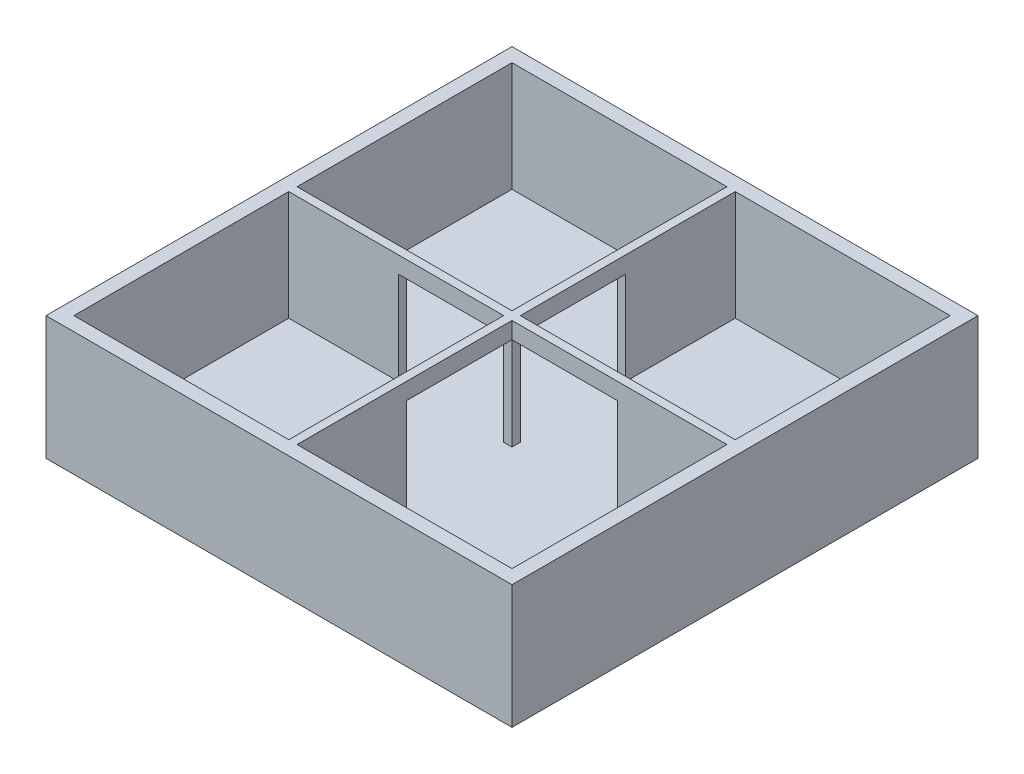
ISO-10303-21;
HEADER;
FILE_DESCRIPTION(('STEP AP214'),'2;1');
FILE_NAME('part.step','',(''),(''),'','','');
FILE_SCHEMA(('AUTOMOTIVE_DESIGN { 1 0 10303 214 1 1 1 1 }'));
ENDSEC;
DATA;
#1=APPLICATION_CONTEXT('core data for automotive mechanical design processes');
#2=APPLICATION_PROTOCOL_DEFINITION('international standard','automotive_design',2000,#1);
#3=PRODUCT_CONTEXT('',#1,'mechanical');
#4=PRODUCT('Part','Part','',(#3));
#5=PRODUCT_RELATED_PRODUCT_CATEGORY('part','',(#4));
#6=PRODUCT_DEFINITION_FORMATION('','',#4);
#7=PRODUCT_DEFINITION_CONTEXT('part definition',#1,'design');
#8=PRODUCT_DEFINITION('design','',#6,#7);
#9=PRODUCT_DEFINITION_SHAPE('','',#8);
#10=(LENGTH_UNIT() NAMED_UNIT(*) SI_UNIT(.MILLI.,.METRE.));
#11=(NAMED_UNIT(*) PLANE_ANGLE_UNIT() SI_UNIT($,.RADIAN.));
#12=(NAMED_UNIT(*) SI_UNIT($,.STERADIAN.) SOLID_ANGLE_UNIT());
#13=UNCERTAINTY_MEASURE_WITH_UNIT(LENGTH_MEASURE(1.E-05),#10,'distance_accuracy_value','');
#14=(GEOMETRIC_REPRESENTATION_CONTEXT(3) GLOBAL_UNCERTAINTY_ASSIGNED_CONTEXT((#13)) GLOBAL_UNIT_ASSIGNED_CONTEXT((#10,
#11,#12)) REPRESENTATION_CONTEXT('',''));
#15=CARTESIAN_POINT('',(0.,0.,0.));
#16=DIRECTION('',(0.,0.,1.));
#17=DIRECTION('',(1.,0.,0.));
#18=AXIS2_PLACEMENT_3D('',#15,#16,#17);
#19=CARTESIAN_POINT('',(0.,-2.54,0.));
#20=DIRECTION('',(0.,1.,0.));
#21=DIRECTION('',(0.,0.,1.));
#22=AXIS2_PLACEMENT_3D('',#19,#20,#21);
#23=PLANE('',#22);
#24=DIRECTION('',(0.,0.,1.));
#25=VECTOR('',#24,1.);
#26=CARTESIAN_POINT('',(76.2000000000027,-2.54,0.));
#27=LINE('',#26,#25);
#28=CARTESIAN_POINT('',(76.2000000000027,-2.54,-76.1999999999982));
#29=VERTEX_POINT('',#28);
#30=CARTESIAN_POINT('',(76.2000000000027,-2.54,76.2000000000018));
#31=VERTEX_POINT('',#30);
#32=EDGE_CURVE('E357',#29,#31,#27,.T.);
#33=ORIENTED_EDGE('',*,*,#32,.T.);
#34=DIRECTION('',(1.,0.,0.));
#35=VECTOR('',#34,1.);
#36=CARTESIAN_POINT('',(0.,-2.54,76.2000000000018));
#37=LINE('',#36,#35);
#38=CARTESIAN_POINT('',(-76.1999999999973,-2.54,76.2000000000018));
#39=VERTEX_POINT('',#38);
#40=EDGE_CURVE('E353',#39,#31,#37,.T.);
#41=ORIENTED_EDGE('',*,*,#40,.F.);
#42=DIRECTION('',(0.,0.,1.));
#43=VECTOR('',#42,1.);
#44=CARTESIAN_POINT('',(-76.1999999999973,-2.54,0.));
#45=LINE('',#44,#43);
#46=CARTESIAN_POINT('',(-76.1999999999973,-2.54,-76.1999999999982));
#47=VERTEX_POINT('',#46);
#48=EDGE_CURVE('E359',#47,#39,#45,.T.);
#49=ORIENTED_EDGE('',*,*,#48,.F.);
#50=DIRECTION('',(1.,0.,0.));
#51=VECTOR('',#50,1.);
#52=CARTESIAN_POINT('',(0.,-2.54,-76.1999999999982));
#53=LINE('',#52,#51);
#54=EDGE_CURVE('E363',#47,#29,#53,.T.);
#55=ORIENTED_EDGE('',*,*,#54,.T.);
#56=EDGE_LOOP('',(#33,#41,#49,#55));
#57=FACE_BOUND('',#56,.T.);
#58=DIRECTION('',(1.,0.,0.));
#59=VECTOR('',#58,1.);
#60=CARTESIAN_POINT('',(3999.99708000001,-2.54,3999.99708));
#61=LINE('',#60,#59);
#62=CARTESIAN_POINT('',(-3999.99708,-2.54,3999.99708));
#63=VERTEX_POINT('',#62);
#64=CARTESIAN_POINT('',(-76.2000000000373,-2.54,3999.99708));
#65=VERTEX_POINT('',#64);
#66=EDGE_CURVE('E264',#63,#65,#61,.T.);
#67=ORIENTED_EDGE('',*,*,#66,.T.);
#68=DIRECTION('',(0.,0.,1.));
#69=VECTOR('',#68,1.);
#70=CARTESIAN_POINT('',(-76.2000000000366,-2.54,3999.99708));
#71=LINE('',#70,#69);
#72=CARTESIAN_POINT('',(-76.1999999999893,-2.54,2000.00108));
#73=VERTEX_POINT('',#72);
#74=EDGE_CURVE('E68',#73,#65,#71,.T.);
#75=ORIENTED_EDGE('',*,*,#74,.F.);
#76=DIRECTION('',(-1.,0.,0.));
#77=VECTOR('',#76,1.);
#78=CARTESIAN_POINT('',(-76.1999999999893,-2.54,2000.00108));
#79=LINE('',#78,#77);
#80=CARTESIAN_POINT('',(76.200000000009,-2.54,2000.00108));
#81=VERTEX_POINT('',#80);
#82=EDGE_CURVE('E63',#81,#73,#79,.T.);
#83=ORIENTED_EDGE('',*,*,#82,.F.);
#84=DIRECTION('',(0.,0.,-1.));
#85=VECTOR('',#84,1.);
#86=CARTESIAN_POINT('',(76.200000000009,-2.54,2000.00108));
#87=LINE('',#86,#85);
#88=CARTESIAN_POINT('',(76.1999999999617,-2.54,3999.99708));
#89=VERTEX_POINT('',#88);
#90=EDGE_CURVE('E248',#89,#81,#87,.T.);
#91=ORIENTED_EDGE('',*,*,#90,.F.);
#92=CARTESIAN_POINT('',(3999.99708000001,-2.54,3999.99708));
#93=VERTEX_POINT('',#92);
#94=EDGE_CURVE('E257',#89,#93,#61,.T.);
#95=ORIENTED_EDGE('',*,*,#94,.T.);
#96=DIRECTION('',(0.,0.,-1.));
#97=VECTOR('',#96,1.);
#98=CARTESIAN_POINT('',(3999.99708000001,-2.54,3999.99708));
#99=LINE('',#98,#97);
#100=CARTESIAN_POINT('',(3999.99708,-2.54,76.2000000000227));
#101=VERTEX_POINT('',#100);
#102=EDGE_CURVE('E451',#93,#101,#99,.T.);
#103=ORIENTED_EDGE('',*,*,#102,.T.);
#104=DIRECTION('',(1.,0.,0.));
#105=VECTOR('',#104,1.);
#106=CARTESIAN_POINT('',(3999.99708,-2.54,76.2000000000227));
#107=LINE('',#106,#105);
#108=CARTESIAN_POINT('',(2000.00108000001,-2.54,76.1999999999942));
#109=VERTEX_POINT('',#108);
#110=EDGE_CURVE('E294',#109,#101,#107,.T.);
#111=ORIENTED_EDGE('',*,*,#110,.F.);
#112=DIRECTION('',(0.,0.,1.));
#113=VECTOR('',#112,1.);
#114=CARTESIAN_POINT('',(2000.00108000001,-2.54,76.1999999999942));
#115=LINE('',#114,#113);
#116=CARTESIAN_POINT('',(2000.00108000001,-2.54,-76.2000000000041));
#117=VERTEX_POINT('',#116);
#118=EDGE_CURVE('E284',#117,#109,#115,.T.);
#119=ORIENTED_EDGE('',*,*,#118,.F.);
#120=DIRECTION('',(-1.,0.,0.));
#121=VECTOR('',#120,1.);
#122=CARTESIAN_POINT('',(2000.00108000001,-2.54,-76.2000000000041));
#123=LINE('',#122,#121);
#124=CARTESIAN_POINT('',(3999.99708,-2.54,-76.1999999999757));
#125=VERTEX_POINT('',#124);
#126=EDGE_CURVE('E290',#125,#117,#123,.T.);
#127=ORIENTED_EDGE('',*,*,#126,.F.);
#128=CARTESIAN_POINT('',(3999.99708,-2.54,-3999.99708));
#129=VERTEX_POINT('',#128);
#130=EDGE_CURVE('E450',#125,#129,#99,.T.);
#131=ORIENTED_EDGE('',*,*,#130,.T.);
#132=DIRECTION('',(-1.,0.,0.));
#133=VECTOR('',#132,1.);
#134=CARTESIAN_POINT('',(3999.99708,-2.54,-3999.99708));
#135=LINE('',#134,#133);
#136=CARTESIAN_POINT('',(76.200000000008,-2.54,-3999.99708));
#137=VERTEX_POINT('',#136);
#138=EDGE_CURVE('E455',#129,#137,#135,.T.);
#139=ORIENTED_EDGE('',*,*,#138,.T.);
#140=DIRECTION('',(0.,0.,-1.));
#141=VECTOR('',#140,1.);
#142=CARTESIAN_POINT('',(76.2000000000082,-2.54,-3999.99708));
#143=LINE('',#142,#141);
#144=CARTESIAN_POINT('',(76.1999999999994,-2.54,-2000.00108));
#145=VERTEX_POINT('',#144);
#146=EDGE_CURVE('E318',#145,#137,#143,.T.);
#147=ORIENTED_EDGE('',*,*,#146,.F.);
#148=DIRECTION('',(1.,0.,0.));
#149=VECTOR('',#148,1.);
#150=CARTESIAN_POINT('',(76.1999999999994,-2.54,-2000.00108));
#151=LINE('',#150,#149);
#152=CARTESIAN_POINT('',(-76.199999999999,-2.54,-2000.00108));
#153=VERTEX_POINT('',#152);
#154=EDGE_CURVE('E308',#153,#145,#151,.T.);
#155=ORIENTED_EDGE('',*,*,#154,.F.);
#156=DIRECTION('',(0.,0.,1.));
#157=VECTOR('',#156,1.);
#158=CARTESIAN_POINT('',(-76.199999999999,-2.54,-2000.00108));
#159=LINE('',#158,#157);
#160=CARTESIAN_POINT('',(-76.1999999999901,-2.54,-3999.99708));
#161=VERTEX_POINT('',#160);
#162=EDGE_CURVE('E314',#161,#153,#159,.T.);
#163=ORIENTED_EDGE('',*,*,#162,.F.);
#164=CARTESIAN_POINT('',(-3999.99708,-2.54,-3999.99708));
#165=VERTEX_POINT('',#164);
#166=EDGE_CURVE('E454',#161,#165,#135,.T.);
#167=ORIENTED_EDGE('',*,*,#166,.T.);
#168=DIRECTION('',(0.,0.,1.));
#169=VECTOR('',#168,1.);
#170=CARTESIAN_POINT('',(-3999.99708,-2.54,3999.99708));
#171=LINE('',#170,#169);
#172=CARTESIAN_POINT('',(-3999.99708,-2.54,-76.1999999999947));
#173=VERTEX_POINT('',#172);
#174=EDGE_CURVE('E265',#165,#173,#171,.T.);
#175=ORIENTED_EDGE('',*,*,#174,.T.);
#176=DIRECTION('',(-1.,0.,0.));
#177=VECTOR('',#176,1.);
#178=CARTESIAN_POINT('',(-3999.99708,-2.54,-76.1999999999947));
#179=LINE('',#178,#177);
#180=CARTESIAN_POINT('',(-2000.00108,-2.54,-76.1999999999947));
#181=VERTEX_POINT('',#180);
#182=EDGE_CURVE('E332',#181,#173,#179,.T.);
#183=ORIENTED_EDGE('',*,*,#182,.F.);
#184=DIRECTION('',(0.,0.,-1.));
#185=VECTOR('',#184,1.);
#186=CARTESIAN_POINT('',(-2000.00108,-2.54,-76.1999999999947));
#187=LINE('',#186,#185);
#188=CARTESIAN_POINT('',(-2000.00108,-2.54,76.2000000000036));
#189=VERTEX_POINT('',#188);
#190=EDGE_CURVE('E338',#189,#181,#187,.T.);
#191=ORIENTED_EDGE('',*,*,#190,.F.);
#192=DIRECTION('',(1.,0.,0.));
#193=VECTOR('',#192,1.);
#194=CARTESIAN_POINT('',(-2000.00108,-2.54,76.2000000000036));
#195=LINE('',#194,#193);
#196=CARTESIAN_POINT('',(-3999.99708,-2.54,76.2000000000036));
#197=VERTEX_POINT('',#196);
#198=EDGE_CURVE('E331',#197,#189,#195,.T.);
#199=ORIENTED_EDGE('',*,*,#198,.F.);
#200=EDGE_CURVE('E445',#197,#63,#171,.T.);
#201=ORIENTED_EDGE('',*,*,#200,.T.);
#202=EDGE_LOOP('',(#67,#75,#83,#91,#95,#103,#111,#119,#127,#131,#139,#147,#155,#163,#167,#175,
#183,#191,#199,#201));
#203=FACE_BOUND('',#202,.T.);
#204=ADVANCED_FACE('F45',(#57,#203),#23,.T.);
#205=CARTESIAN_POINT('',(0.,1695.20616,0.));
#206=DIRECTION('',(0.,1.,0.));
#207=DIRECTION('',(0.,0.,1.));
#208=AXIS2_PLACEMENT_3D('',#205,#206,#207);
#209=PLANE('',#208);
#210=DIRECTION('',(1.,0.,0.));
#211=VECTOR('',#210,1.);
#212=CARTESIAN_POINT('',(0.,1695.20616,2000.00108));
#213=LINE('',#212,#211);
#214=CARTESIAN_POINT('',(-76.1999999999973,1695.20616,2000.00108));
#215=VERTEX_POINT('',#214);
#216=CARTESIAN_POINT('',(76.2000000000027,1695.20616,2000.00108));
#217=VERTEX_POINT('',#216);
#218=EDGE_CURVE('E279',#215,#217,#213,.T.);
#219=ORIENTED_EDGE('',*,*,#218,.F.);
#220=DIRECTION('',(0.,0.,1.));
#221=VECTOR('',#220,1.);
#222=CARTESIAN_POINT('',(-76.1999999999973,1695.20616,0.));
#223=LINE('',#222,#221);
#224=CARTESIAN_POINT('',(-76.1999999999973,1695.20616,76.2000000000018));
#225=VERTEX_POINT('',#224);
#226=EDGE_CURVE('E255',#225,#215,#223,.T.);
#227=ORIENTED_EDGE('',*,*,#226,.F.);
#228=DIRECTION('',(1.,0.,0.));
#229=VECTOR('',#228,1.);
#230=CARTESIAN_POINT('',(0.,1695.20616,76.2000000000018));
#231=LINE('',#230,#229);
#232=CARTESIAN_POINT('',(76.2000000000027,1695.20616,76.2000000000018));
#233=VERTEX_POINT('',#232);
#234=EDGE_CURVE('E374',#225,#233,#231,.T.);
#235=ORIENTED_EDGE('',*,*,#234,.T.);
#236=DIRECTION('',(0.,0.,1.));
#237=VECTOR('',#236,1.);
#238=CARTESIAN_POINT('',(76.2000000000027,1695.20616,0.));
#239=LINE('',#238,#237);
#240=EDGE_CURVE('E485',#233,#217,#239,.T.);
#241=ORIENTED_EDGE('',*,*,#240,.T.);
#242=EDGE_LOOP('',(#219,#227,#235,#241));
#243=FACE_BOUND('',#242,.T.);
#244=ADVANCED_FACE('F634',(#243),#209,.F.);
#245=CARTESIAN_POINT('',(3999.99708000001,-2.54,3999.99708));
#246=DIRECTION('',(0.,0.,1.));
#247=DIRECTION('',(1.,0.,0.));
#248=AXIS2_PLACEMENT_3D('',#245,#246,#247);
#249=PLANE('',#248);
#250=DIRECTION('',(0.,1.,0.));
#251=VECTOR('',#250,1.);
#252=CARTESIAN_POINT('',(-76.1999999999973,1695.20616,3999.99708));
#253=LINE('',#252,#251);
#254=CARTESIAN_POINT('',(-76.1999999999974,2000.00616,3999.99708));
#255=VERTEX_POINT('',#254);
#256=EDGE_CURVE('E11',#65,#255,#253,.T.);
#257=ORIENTED_EDGE('',*,*,#256,.F.);
#258=ORIENTED_EDGE('',*,*,#66,.F.);
#259=DIRECTION('',(0.,1.,0.));
#260=VECTOR('',#259,1.);
#261=CARTESIAN_POINT('',(-3999.99708,-2.54,3999.99708));
#262=LINE('',#261,#260);
#263=CARTESIAN_POINT('',(-3999.99708,2000.00616,3999.99708));
#264=VERTEX_POINT('',#263);
#265=EDGE_CURVE('E459',#63,#264,#262,.T.);
#266=ORIENTED_EDGE('',*,*,#265,.T.);
#267=DIRECTION('',(1.,0.,0.));
#268=VECTOR('',#267,1.);
#269=CARTESIAN_POINT('',(3999.99708000001,2000.00616,3999.99708));
#270=LINE('',#269,#268);
#271=EDGE_CURVE('E416',#264,#255,#270,.T.);
#272=ORIENTED_EDGE('',*,*,#271,.T.);
#273=EDGE_LOOP('',(#257,#258,#266,#272));
#274=FACE_BOUND('',#273,.T.);
#275=ADVANCED_FACE('F670',(#274),#249,.F.);
#276=ORIENTED_EDGE('',*,*,#94,.F.);
#277=DIRECTION('',(0.,1.,0.));
#278=VECTOR('',#277,1.);
#279=CARTESIAN_POINT('',(76.2000000000027,1695.20616,3999.99708));
#280=LINE('',#279,#278);
#281=CARTESIAN_POINT('',(76.2000000000027,2000.00616,3999.99708));
#282=VERTEX_POINT('',#281);
#283=EDGE_CURVE('E49',#89,#282,#280,.T.);
#284=ORIENTED_EDGE('',*,*,#283,.T.);
#285=CARTESIAN_POINT('',(3999.99708000001,2000.00616,3999.99708));
#286=VERTEX_POINT('',#285);
#287=EDGE_CURVE('E415',#282,#286,#270,.T.);
#288=ORIENTED_EDGE('',*,*,#287,.T.);
#289=DIRECTION('',(0.,1.,0.));
#290=VECTOR('',#289,1.);
#291=CARTESIAN_POINT('',(3999.99708000001,-2.54,3999.99708));
#292=LINE('',#291,#290);
#293=EDGE_CURVE('E260',#93,#286,#292,.T.);
#294=ORIENTED_EDGE('',*,*,#293,.F.);
#295=EDGE_LOOP('',(#276,#284,#288,#294));
#296=FACE_BOUND('',#295,.T.);
#297=ADVANCED_FACE('F258',(#296),#249,.F.);
#298=DIRECTION('',(0.,0.,-1.));
#299=VECTOR('',#298,1.);
#300=CARTESIAN_POINT('',(2000.00108000001,1695.20616,0.));
#301=LINE('',#300,#299);
#302=CARTESIAN_POINT('',(2000.00108000001,1695.20616,76.2000000000018));
#303=VERTEX_POINT('',#302);
#304=CARTESIAN_POINT('',(2000.00108000001,1695.20616,-76.1999999999982));
#305=VERTEX_POINT('',#304);
#306=EDGE_CURVE('E288',#303,#305,#301,.T.);
#307=ORIENTED_EDGE('',*,*,#306,.F.);
#308=DIRECTION('',(1.,0.,0.));
#309=VECTOR('',#308,1.);
#310=CARTESIAN_POINT('',(0.,1695.20616,76.2000000000018));
#311=LINE('',#310,#309);
#312=EDGE_CURVE('E488',#233,#303,#311,.T.);
#313=ORIENTED_EDGE('',*,*,#312,.F.);
#314=DIRECTION('',(0.,0.,1.));
#315=VECTOR('',#314,1.);
#316=CARTESIAN_POINT('',(76.2000000000027,1695.20616,0.));
#317=LINE('',#316,#315);
#318=CARTESIAN_POINT('',(76.2000000000027,1695.20616,-76.1999999999982));
#319=VERTEX_POINT('',#318);
#320=EDGE_CURVE('E352',#319,#233,#317,.T.);
#321=ORIENTED_EDGE('',*,*,#320,.F.);
#322=DIRECTION('',(1.,0.,0.));
#323=VECTOR('',#322,1.);
#324=CARTESIAN_POINT('',(0.,1695.20616,-76.1999999999982));
#325=LINE('',#324,#323);
#326=EDGE_CURVE('E493',#319,#305,#325,.T.);
#327=ORIENTED_EDGE('',*,*,#326,.T.);
#328=EDGE_LOOP('',(#307,#313,#321,#327));
#329=FACE_BOUND('',#328,.T.);
#330=ADVANCED_FACE('F662',(#329),#209,.F.);
#331=CARTESIAN_POINT('',(3999.99708000001,-2.54,3999.99708));
#332=DIRECTION('',(1.,0.,0.));
#333=DIRECTION('',(0.,0.,-1.));
#334=AXIS2_PLACEMENT_3D('',#331,#332,#333);
#335=PLANE('',#334);
#336=DIRECTION('',(0.,1.,0.));
#337=VECTOR('',#336,1.);
#338=CARTESIAN_POINT('',(3999.99708,1695.20616,76.2000000000018));
#339=LINE('',#338,#337);
#340=CARTESIAN_POINT('',(3999.99708,2000.00616,76.2000000000018));
#341=VERTEX_POINT('',#340);
#342=EDGE_CURVE('E564',#101,#341,#339,.T.);
#343=ORIENTED_EDGE('',*,*,#342,.F.);
#344=ORIENTED_EDGE('',*,*,#102,.F.);
#345=ORIENTED_EDGE('',*,*,#293,.T.);
#346=DIRECTION('',(0.,0.,-1.));
#347=VECTOR('',#346,1.);
#348=CARTESIAN_POINT('',(3999.99708000001,2000.00616,3999.99708));
#349=LINE('',#348,#347);
#350=EDGE_CURVE('E421',#286,#341,#349,.T.);
#351=ORIENTED_EDGE('',*,*,#350,.T.);
#352=EDGE_LOOP('',(#343,#344,#345,#351));
#353=FACE_BOUND('',#352,.T.);
#354=ADVANCED_FACE('F579',(#353),#335,.F.);
#355=ORIENTED_EDGE('',*,*,#130,.F.);
#356=DIRECTION('',(0.,1.,0.));
#357=VECTOR('',#356,1.);
#358=CARTESIAN_POINT('',(3999.99708,1695.20616,-76.1999999999982));
#359=LINE('',#358,#357);
#360=CARTESIAN_POINT('',(3999.99708,2000.00616,-76.1999999999983));
#361=VERTEX_POINT('',#360);
#362=EDGE_CURVE('E560',#125,#361,#359,.T.);
#363=ORIENTED_EDGE('',*,*,#362,.T.);
#364=CARTESIAN_POINT('',(3999.99708,2000.00616,-3999.99708));
#365=VERTEX_POINT('',#364);
#366=EDGE_CURVE('E420',#361,#365,#349,.T.);
#367=ORIENTED_EDGE('',*,*,#366,.T.);
#368=DIRECTION('',(0.,1.,0.));
#369=VECTOR('',#368,1.);
#370=CARTESIAN_POINT('',(3999.99708,-2.54,-3999.99708));
#371=LINE('',#370,#369);
#372=EDGE_CURVE('E465',#129,#365,#371,.T.);
#373=ORIENTED_EDGE('',*,*,#372,.F.);
#374=EDGE_LOOP('',(#355,#363,#367,#373));
#375=FACE_BOUND('',#374,.T.);
#376=ADVANCED_FACE('F593',(#375),#335,.F.);
#377=DIRECTION('',(-1.,0.,0.));
#378=VECTOR('',#377,1.);
#379=CARTESIAN_POINT('',(0.,1695.20616,-2000.00108));
#380=LINE('',#379,#378);
#381=CARTESIAN_POINT('',(76.2000000000027,1695.20616,-2000.00108));
#382=VERTEX_POINT('',#381);
#383=CARTESIAN_POINT('',(-76.1999999999973,1695.20616,-2000.00108));
#384=VERTEX_POINT('',#383);
#385=EDGE_CURVE('E312',#382,#384,#380,.T.);
#386=ORIENTED_EDGE('',*,*,#385,.F.);
#387=DIRECTION('',(0.,0.,1.));
#388=VECTOR('',#387,1.);
#389=CARTESIAN_POINT('',(76.2000000000027,1695.20616,0.));
#390=LINE('',#389,#388);
#391=EDGE_CURVE('E496',#382,#319,#390,.T.);
#392=ORIENTED_EDGE('',*,*,#391,.T.);
#393=DIRECTION('',(1.,0.,0.));
#394=VECTOR('',#393,1.);
#395=CARTESIAN_POINT('',(0.,1695.20616,-76.1999999999982));
#396=LINE('',#395,#394);
#397=CARTESIAN_POINT('',(-76.1999999999973,1695.20616,-76.1999999999982));
#398=VERTEX_POINT('',#397);
#399=EDGE_CURVE('E375',#398,#319,#396,.T.);
#400=ORIENTED_EDGE('',*,*,#399,.F.);
#401=DIRECTION('',(0.,0.,1.));
#402=VECTOR('',#401,1.);
#403=CARTESIAN_POINT('',(-76.1999999999973,1695.20616,0.));
#404=LINE('',#403,#402);
#405=EDGE_CURVE('E499',#384,#398,#404,.T.);
#406=ORIENTED_EDGE('',*,*,#405,.F.);
#407=EDGE_LOOP('',(#386,#392,#400,#406));
#408=FACE_BOUND('',#407,.T.);
#409=ADVANCED_FACE('F672',(#408),#209,.F.);
#410=CARTESIAN_POINT('',(3999.99708,-2.54,-3999.99708));
#411=DIRECTION('',(0.,0.,-1.));
#412=DIRECTION('',(-1.,0.,0.));
#413=AXIS2_PLACEMENT_3D('',#410,#411,#412);
#414=PLANE('',#413);
#415=DIRECTION('',(0.,1.,0.));
#416=VECTOR('',#415,1.);
#417=CARTESIAN_POINT('',(76.2000000000027,1695.20616,-3999.99708));
#418=LINE('',#417,#416);
#419=CARTESIAN_POINT('',(76.2000000000027,2000.00616,-3999.99708));
#420=VERTEX_POINT('',#419);
#421=EDGE_CURVE('E552',#137,#420,#418,.T.);
#422=ORIENTED_EDGE('',*,*,#421,.F.);
#423=ORIENTED_EDGE('',*,*,#138,.F.);
#424=ORIENTED_EDGE('',*,*,#372,.T.);
#425=DIRECTION('',(-1.,0.,0.));
#426=VECTOR('',#425,1.);
#427=CARTESIAN_POINT('',(3999.99708,2000.00616,-3999.99708));
#428=LINE('',#427,#426);
#429=EDGE_CURVE('E426',#365,#420,#428,.T.);
#430=ORIENTED_EDGE('',*,*,#429,.T.);
#431=EDGE_LOOP('',(#422,#423,#424,#430));
#432=FACE_BOUND('',#431,.T.);
#433=ADVANCED_FACE('F597',(#432),#414,.F.);
#434=ORIENTED_EDGE('',*,*,#166,.F.);
#435=DIRECTION('',(0.,1.,0.));
#436=VECTOR('',#435,1.);
#437=CARTESIAN_POINT('',(-76.1999999999973,1695.20616,-3999.99708));
#438=LINE('',#437,#436);
#439=CARTESIAN_POINT('',(-76.1999999999974,2000.00616,-3999.99708));
#440=VERTEX_POINT('',#439);
#441=EDGE_CURVE('E549',#161,#440,#438,.T.);
#442=ORIENTED_EDGE('',*,*,#441,.T.);
#443=CARTESIAN_POINT('',(-3999.99708,2000.00616,-3999.99708));
#444=VERTEX_POINT('',#443);
#445=EDGE_CURVE('E425',#440,#444,#428,.T.);
#446=ORIENTED_EDGE('',*,*,#445,.T.);
#447=DIRECTION('',(0.,1.,0.));
#448=VECTOR('',#447,1.);
#449=CARTESIAN_POINT('',(-3999.99708,-2.54,-3999.99708));
#450=LINE('',#449,#448);
#451=EDGE_CURVE('E460',#165,#444,#450,.T.);
#452=ORIENTED_EDGE('',*,*,#451,.F.);
#453=EDGE_LOOP('',(#434,#442,#446,#452));
#454=FACE_BOUND('',#453,.T.);
#455=ADVANCED_FACE('F621',(#454),#414,.F.);
#456=DIRECTION('',(0.,0.,1.));
#457=VECTOR('',#456,1.);
#458=CARTESIAN_POINT('',(-2000.00108,1695.20616,0.));
#459=LINE('',#458,#457);
#460=CARTESIAN_POINT('',(-2000.00108,1695.20616,-76.1999999999947));
#461=VERTEX_POINT('',#460);
#462=CARTESIAN_POINT('',(-2000.00108,1695.20616,76.2000000000036));
#463=VERTEX_POINT('',#462);
#464=EDGE_CURVE('E336',#461,#463,#459,.T.);
#465=ORIENTED_EDGE('',*,*,#464,.F.);
#466=DIRECTION('',(1.,0.,0.));
#467=VECTOR('',#466,1.);
#468=CARTESIAN_POINT('',(0.,1695.20616,-76.1999999999982));
#469=LINE('',#468,#467);
#470=EDGE_CURVE('E502',#461,#398,#469,.T.);
#471=ORIENTED_EDGE('',*,*,#470,.T.);
#472=DIRECTION('',(0.,0.,1.));
#473=VECTOR('',#472,1.);
#474=CARTESIAN_POINT('',(-76.1999999999973,1695.20616,0.));
#475=LINE('',#474,#473);
#476=EDGE_CURVE('E367',#398,#225,#475,.T.);
#477=ORIENTED_EDGE('',*,*,#476,.T.);
#478=DIRECTION('',(1.,0.,0.));
#479=VECTOR('',#478,1.);
#480=CARTESIAN_POINT('',(0.,1695.20616,76.2000000000018));
#481=LINE('',#480,#479);
#482=EDGE_CURVE('E506',#463,#225,#481,.T.);
#483=ORIENTED_EDGE('',*,*,#482,.F.);
#484=EDGE_LOOP('',(#465,#471,#477,#483));
#485=FACE_BOUND('',#484,.T.);
#486=ADVANCED_FACE('F646',(#485),#209,.F.);
#487=CARTESIAN_POINT('',(-3999.99708,-2.54,3999.99708));
#488=DIRECTION('',(-1.,0.,0.));
#489=DIRECTION('',(0.,0.,1.));
#490=AXIS2_PLACEMENT_3D('',#487,#488,#489);
#491=PLANE('',#490);
#492=ORIENTED_EDGE('',*,*,#200,.F.);
#493=DIRECTION('',(0.,1.,0.));
#494=VECTOR('',#493,1.);
#495=CARTESIAN_POINT('',(-3999.99708,1695.20616,76.2000000000018));
#496=LINE('',#495,#494);
#497=CARTESIAN_POINT('',(-3999.99708,2000.00616,76.2000000000036));
#498=VERTEX_POINT('',#497);
#499=EDGE_CURVE('E538',#197,#498,#496,.T.);
#500=ORIENTED_EDGE('',*,*,#499,.T.);
#501=DIRECTION('',(0.,0.,1.));
#502=VECTOR('',#501,1.);
#503=CARTESIAN_POINT('',(-3999.99708,2000.00616,3999.99708));
#504=LINE('',#503,#502);
#505=EDGE_CURVE('E411',#498,#264,#504,.T.);
#506=ORIENTED_EDGE('',*,*,#505,.T.);
#507=ORIENTED_EDGE('',*,*,#265,.F.);
#508=EDGE_LOOP('',(#492,#500,#506,#507));
#509=FACE_BOUND('',#508,.T.);
#510=ADVANCED_FACE('F676',(#509),#491,.F.);
#511=DIRECTION('',(0.,1.,0.));
#512=VECTOR('',#511,1.);
#513=CARTESIAN_POINT('',(-3999.99708,1695.20616,-76.1999999999982));
#514=LINE('',#513,#512);
#515=CARTESIAN_POINT('',(-3999.99708,2000.00616,-76.1999999999947));
#516=VERTEX_POINT('',#515);
#517=EDGE_CURVE('E541',#173,#516,#514,.T.);
#518=ORIENTED_EDGE('',*,*,#517,.F.);
#519=ORIENTED_EDGE('',*,*,#174,.F.);
#520=ORIENTED_EDGE('',*,*,#451,.T.);
#521=EDGE_CURVE('E412',#444,#516,#504,.T.);
#522=ORIENTED_EDGE('',*,*,#521,.T.);
#523=EDGE_LOOP('',(#518,#519,#520,#522));
#524=FACE_BOUND('',#523,.T.);
#525=ADVANCED_FACE('F693',(#524),#491,.F.);
#526=CARTESIAN_POINT('',(-76.1999999999973,1695.20616,0.));
#527=DIRECTION('',(-1.,0.,0.));
#528=DIRECTION('',(0.,0.,1.));
#529=AXIS2_PLACEMENT_3D('',#526,#527,#528);
#530=PLANE('',#529);
#531=ORIENTED_EDGE('',*,*,#256,.T.);
#532=DIRECTION('',(0.,0.,1.));
#533=VECTOR('',#532,1.);
#534=CARTESIAN_POINT('',(-76.1999999999973,2000.00616,0.));
#535=LINE('',#534,#533);
#536=CARTESIAN_POINT('',(-76.1999999999973,2000.00616,76.2000000000018));
#537=VERTEX_POINT('',#536);
#538=EDGE_CURVE('E489',#537,#255,#535,.T.);
#539=ORIENTED_EDGE('',*,*,#538,.F.);
#540=DIRECTION('',(0.,1.,0.));
#541=VECTOR('',#540,1.);
#542=CARTESIAN_POINT('',(-76.1999999999973,1695.20616,76.2000000000018));
#543=LINE('',#542,#541);
#544=EDGE_CURVE('E55',#225,#537,#543,.T.);
#545=ORIENTED_EDGE('',*,*,#544,.F.);
#546=ORIENTED_EDGE('',*,*,#226,.T.);
#547=DIRECTION('',(0.,-1.,0.));
#548=VECTOR('',#547,1.);
#549=CARTESIAN_POINT('',(-76.1999999999893,4005.80020725809,2000.00108));
#550=LINE('',#549,#548);
#551=EDGE_CURVE('E273',#215,#73,#550,.T.);
#552=ORIENTED_EDGE('',*,*,#551,.T.);
#553=ORIENTED_EDGE('',*,*,#74,.T.);
#554=EDGE_LOOP('',(#531,#539,#545,#546,#552,#553));
#555=FACE_BOUND('',#554,.T.);
#556=ADVANCED_FACE('F637',(#555),#530,.T.);
#557=CARTESIAN_POINT('',(0.,1695.20616,76.2000000000018));
#558=DIRECTION('',(0.,0.,1.));
#559=DIRECTION('',(1.,0.,0.));
#560=AXIS2_PLACEMENT_3D('',#557,#558,#559);
#561=PLANE('',#560);
#562=ORIENTED_EDGE('',*,*,#499,.F.);
#563=ORIENTED_EDGE('',*,*,#198,.T.);
#564=DIRECTION('',(0.,-1.,0.));
#565=VECTOR('',#564,1.);
#566=CARTESIAN_POINT('',(-2000.00108,4005.80020725809,76.2000000000036));
#567=LINE('',#566,#565);
#568=EDGE_CURVE('E341',#463,#189,#567,.T.);
#569=ORIENTED_EDGE('',*,*,#568,.F.);
#570=ORIENTED_EDGE('',*,*,#482,.T.);
#571=ORIENTED_EDGE('',*,*,#544,.T.);
#572=DIRECTION('',(1.,0.,0.));
#573=VECTOR('',#572,1.);
#574=CARTESIAN_POINT('',(0.,2000.00616,76.2000000000018));
#575=LINE('',#574,#573);
#576=EDGE_CURVE('E530',#498,#537,#575,.T.);
#577=ORIENTED_EDGE('',*,*,#576,.F.);
#578=EDGE_LOOP('',(#562,#563,#569,#570,#571,#577));
#579=FACE_BOUND('',#578,.T.);
#580=ADVANCED_FACE('F876',(#579),#561,.T.);
#581=CARTESIAN_POINT('',(0.,1695.20616,-76.1999999999982));
#582=DIRECTION('',(0.,0.,1.));
#583=DIRECTION('',(1.,0.,0.));
#584=AXIS2_PLACEMENT_3D('',#581,#582,#583);
#585=PLANE('',#584);
#586=DIRECTION('',(1.,0.,0.));
#587=VECTOR('',#586,1.);
#588=CARTESIAN_POINT('',(0.,2000.00616,-76.1999999999982));
#589=LINE('',#588,#587);
#590=CARTESIAN_POINT('',(-76.1999999999973,2000.00616,-76.1999999999982));
#591=VERTEX_POINT('',#590);
#592=EDGE_CURVE('E526',#516,#591,#589,.T.);
#593=ORIENTED_EDGE('',*,*,#592,.T.);
#594=DIRECTION('',(0.,1.,0.));
#595=VECTOR('',#594,1.);
#596=CARTESIAN_POINT('',(-76.1999999999973,1695.20616,-76.1999999999982));
#597=LINE('',#596,#595);
#598=EDGE_CURVE('E545',#398,#591,#597,.T.);
#599=ORIENTED_EDGE('',*,*,#598,.F.);
#600=ORIENTED_EDGE('',*,*,#470,.F.);
#601=DIRECTION('',(0.,-1.,0.));
#602=VECTOR('',#601,1.);
#603=CARTESIAN_POINT('',(-2000.00108,4005.80020725809,-76.1999999999947));
#604=LINE('',#603,#602);
#605=EDGE_CURVE('E337',#461,#181,#604,.T.);
#606=ORIENTED_EDGE('',*,*,#605,.T.);
#607=ORIENTED_EDGE('',*,*,#182,.T.);
#608=ORIENTED_EDGE('',*,*,#517,.T.);
#609=EDGE_LOOP('',(#593,#599,#600,#606,#607,#608));
#610=FACE_BOUND('',#609,.T.);
#611=ADVANCED_FACE('F865',(#610),#585,.F.);
#612=CARTESIAN_POINT('',(-76.1999999999973,1695.20616,0.));
#613=DIRECTION('',(-1.,0.,0.));
#614=DIRECTION('',(0.,0.,1.));
#615=AXIS2_PLACEMENT_3D('',#612,#613,#614);
#616=PLANE('',#615);
#617=DIRECTION('',(0.,-1.,0.));
#618=VECTOR('',#617,1.);
#619=CARTESIAN_POINT('',(-76.199999999999,4005.80020725809,-2000.00108));
#620=LINE('',#619,#618);
#621=EDGE_CURVE('E313',#384,#153,#620,.T.);
#622=ORIENTED_EDGE('',*,*,#621,.F.);
#623=ORIENTED_EDGE('',*,*,#405,.T.);
#624=ORIENTED_EDGE('',*,*,#598,.T.);
#625=DIRECTION('',(0.,0.,1.));
#626=VECTOR('',#625,1.);
#627=CARTESIAN_POINT('',(-76.1999999999973,2000.00616,0.));
#628=LINE('',#627,#626);
#629=EDGE_CURVE('E523',#440,#591,#628,.T.);
#630=ORIENTED_EDGE('',*,*,#629,.F.);
#631=ORIENTED_EDGE('',*,*,#441,.F.);
#632=ORIENTED_EDGE('',*,*,#162,.T.);
#633=EDGE_LOOP('',(#622,#623,#624,#630,#631,#632));
#634=FACE_BOUND('',#633,.T.);
#635=ADVANCED_FACE('F616',(#634),#616,.T.);
#636=CARTESIAN_POINT('',(76.2000000000027,1695.20616,0.));
#637=DIRECTION('',(-1.,0.,0.));
#638=DIRECTION('',(0.,0.,1.));
#639=AXIS2_PLACEMENT_3D('',#636,#637,#638);
#640=PLANE('',#639);
#641=DIRECTION('',(0.,0.,1.));
#642=VECTOR('',#641,1.);
#643=CARTESIAN_POINT('',(76.2000000000027,2000.00616,0.));
#644=LINE('',#643,#642);
#645=CARTESIAN_POINT('',(76.2000000000027,2000.00616,-76.1999999999982));
#646=VERTEX_POINT('',#645);
#647=EDGE_CURVE('E520',#420,#646,#644,.T.);
#648=ORIENTED_EDGE('',*,*,#647,.T.);
#649=DIRECTION('',(0.,1.,0.));
#650=VECTOR('',#649,1.);
#651=CARTESIAN_POINT('',(76.2000000000027,1695.20616,-76.1999999999982));
#652=LINE('',#651,#650);
#653=EDGE_CURVE('E556',#319,#646,#652,.T.);
#654=ORIENTED_EDGE('',*,*,#653,.F.);
#655=ORIENTED_EDGE('',*,*,#391,.F.);
#656=DIRECTION('',(0.,-1.,0.));
#657=VECTOR('',#656,1.);
#658=CARTESIAN_POINT('',(76.1999999999994,4005.80020725809,-2000.00108));
#659=LINE('',#658,#657);
#660=EDGE_CURVE('E307',#382,#145,#659,.T.);
#661=ORIENTED_EDGE('',*,*,#660,.T.);
#662=ORIENTED_EDGE('',*,*,#146,.T.);
#663=ORIENTED_EDGE('',*,*,#421,.T.);
#664=EDGE_LOOP('',(#648,#654,#655,#661,#662,#663));
#665=FACE_BOUND('',#664,.T.);
#666=ADVANCED_FACE('F600',(#665),#640,.F.);
#667=CARTESIAN_POINT('',(0.,1695.20616,-76.1999999999982));
#668=DIRECTION('',(0.,0.,1.));
#669=DIRECTION('',(1.,0.,0.));
#670=AXIS2_PLACEMENT_3D('',#667,#668,#669);
#671=PLANE('',#670);
#672=ORIENTED_EDGE('',*,*,#362,.F.);
#673=ORIENTED_EDGE('',*,*,#126,.T.);
#674=DIRECTION('',(0.,-1.,0.));
#675=VECTOR('',#674,1.);
#676=CARTESIAN_POINT('',(2000.00108000001,4005.80020725809,-76.2000000000041));
#677=LINE('',#676,#675);
#678=EDGE_CURVE('E289',#305,#117,#677,.T.);
#679=ORIENTED_EDGE('',*,*,#678,.F.);
#680=ORIENTED_EDGE('',*,*,#326,.F.);
#681=ORIENTED_EDGE('',*,*,#653,.T.);
#682=DIRECTION('',(1.,0.,0.));
#683=VECTOR('',#682,1.);
#684=CARTESIAN_POINT('',(0.,2000.00616,-76.1999999999982));
#685=LINE('',#684,#683);
#686=EDGE_CURVE('E517',#646,#361,#685,.T.);
#687=ORIENTED_EDGE('',*,*,#686,.T.);
#688=EDGE_LOOP('',(#672,#673,#679,#680,#681,#687));
#689=FACE_BOUND('',#688,.T.);
#690=ADVANCED_FACE('F587',(#689),#671,.F.);
#691=CARTESIAN_POINT('',(0.,1695.20616,76.2000000000018));
#692=DIRECTION('',(0.,0.,1.));
#693=DIRECTION('',(1.,0.,0.));
#694=AXIS2_PLACEMENT_3D('',#691,#692,#693);
#695=PLANE('',#694);
#696=ORIENTED_EDGE('',*,*,#342,.T.);
#697=DIRECTION('',(1.,0.,0.));
#698=VECTOR('',#697,1.);
#699=CARTESIAN_POINT('',(0.,2000.00616,76.2000000000018));
#700=LINE('',#699,#698);
#701=CARTESIAN_POINT('',(76.2000000000027,2000.00616,76.2000000000018));
#702=VERTEX_POINT('',#701);
#703=EDGE_CURVE('E514',#702,#341,#700,.T.);
#704=ORIENTED_EDGE('',*,*,#703,.F.);
#705=DIRECTION('',(0.,1.,0.));
#706=VECTOR('',#705,1.);
#707=CARTESIAN_POINT('',(76.2000000000027,1695.20616,76.2000000000018));
#708=LINE('',#707,#706);
#709=EDGE_CURVE('E254',#233,#702,#708,.T.);
#710=ORIENTED_EDGE('',*,*,#709,.F.);
#711=ORIENTED_EDGE('',*,*,#312,.T.);
#712=DIRECTION('',(0.,-1.,0.));
#713=VECTOR('',#712,1.);
#714=CARTESIAN_POINT('',(2000.00108000001,4005.80020725809,76.1999999999942));
#715=LINE('',#714,#713);
#716=EDGE_CURVE('E283',#303,#109,#715,.T.);
#717=ORIENTED_EDGE('',*,*,#716,.T.);
#718=ORIENTED_EDGE('',*,*,#110,.T.);
#719=EDGE_LOOP('',(#696,#704,#710,#711,#717,#718));
#720=FACE_BOUND('',#719,.T.);
#721=ADVANCED_FACE('F577',(#720),#695,.T.);
#722=CARTESIAN_POINT('',(76.2000000000027,1695.20616,0.));
#723=DIRECTION('',(-1.,0.,0.));
#724=DIRECTION('',(0.,0.,1.));
#725=AXIS2_PLACEMENT_3D('',#722,#723,#724);
#726=PLANE('',#725);
#727=ORIENTED_EDGE('',*,*,#283,.F.);
#728=ORIENTED_EDGE('',*,*,#90,.T.);
#729=DIRECTION('',(0.,-1.,0.));
#730=VECTOR('',#729,1.);
#731=CARTESIAN_POINT('',(76.200000000009,4005.80020725809,2000.00108));
#732=LINE('',#731,#730);
#733=EDGE_CURVE('E268',#217,#81,#732,.T.);
#734=ORIENTED_EDGE('',*,*,#733,.F.);
#735=ORIENTED_EDGE('',*,*,#240,.F.);
#736=ORIENTED_EDGE('',*,*,#709,.T.);
#737=DIRECTION('',(0.,0.,1.));
#738=VECTOR('',#737,1.);
#739=CARTESIAN_POINT('',(76.2000000000027,2000.00616,0.));
#740=LINE('',#739,#738);
#741=EDGE_CURVE('E250',#702,#282,#740,.T.);
#742=ORIENTED_EDGE('',*,*,#741,.T.);
#743=EDGE_LOOP('',(#727,#728,#734,#735,#736,#742));
#744=FACE_BOUND('',#743,.T.);
#745=ADVANCED_FACE('F47',(#744),#726,.F.);
#746=CARTESIAN_POINT('',(0.,2000.00616,0.));
#747=DIRECTION('',(0.,1.,0.));
#748=DIRECTION('',(0.,0.,1.));
#749=AXIS2_PLACEMENT_3D('',#746,#747,#748);
#750=PLANE('',#749);
#751=ORIENTED_EDGE('',*,*,#538,.T.);
#752=ORIENTED_EDGE('',*,*,#271,.F.);
#753=ORIENTED_EDGE('',*,*,#505,.F.);
#754=ORIENTED_EDGE('',*,*,#576,.T.);
#755=EDGE_LOOP('',(#751,#752,#753,#754));
#756=FACE_BOUND('',#755,.T.);
#757=ORIENTED_EDGE('',*,*,#287,.F.);
#758=ORIENTED_EDGE('',*,*,#741,.F.);
#759=ORIENTED_EDGE('',*,*,#703,.T.);
#760=ORIENTED_EDGE('',*,*,#350,.F.);
#761=EDGE_LOOP('',(#757,#758,#759,#760));
#762=FACE_BOUND('',#761,.T.);
#763=ORIENTED_EDGE('',*,*,#366,.F.);
#764=ORIENTED_EDGE('',*,*,#686,.F.);
#765=ORIENTED_EDGE('',*,*,#647,.F.);
#766=ORIENTED_EDGE('',*,*,#429,.F.);
#767=EDGE_LOOP('',(#763,#764,#765,#766));
#768=FACE_BOUND('',#767,.T.);
#769=ORIENTED_EDGE('',*,*,#445,.F.);
#770=ORIENTED_EDGE('',*,*,#629,.T.);
#771=ORIENTED_EDGE('',*,*,#592,.F.);
#772=ORIENTED_EDGE('',*,*,#521,.F.);
#773=EDGE_LOOP('',(#769,#770,#771,#772));
#774=FACE_BOUND('',#773,.T.);
#775=DIRECTION('',(1.,0.,0.));
#776=VECTOR('',#775,1.);
#777=CARTESIAN_POINT('',(4253.99708,2000.00616,4253.99708));
#778=LINE('',#777,#776);
#779=CARTESIAN_POINT('',(-4253.99708,2000.00616,4253.99708));
#780=VERTEX_POINT('',#779);
#781=CARTESIAN_POINT('',(4253.99708,2000.00616,4253.99708));
#782=VERTEX_POINT('',#781);
#783=EDGE_CURVE('E429',#780,#782,#778,.T.);
#784=ORIENTED_EDGE('',*,*,#783,.T.);
#785=DIRECTION('',(0.,0.,-1.));
#786=VECTOR('',#785,1.);
#787=CARTESIAN_POINT('',(4253.99708,2000.00616,4253.99708));
#788=LINE('',#787,#786);
#789=CARTESIAN_POINT('',(4253.99708,2000.00616,-4253.99708));
#790=VERTEX_POINT('',#789);
#791=EDGE_CURVE('E433',#782,#790,#788,.T.);
#792=ORIENTED_EDGE('',*,*,#791,.T.);
#793=DIRECTION('',(-1.,0.,0.));
#794=VECTOR('',#793,1.);
#795=CARTESIAN_POINT('',(4253.99708,2000.00616,-4253.99708));
#796=LINE('',#795,#794);
#797=CARTESIAN_POINT('',(-4253.99708,2000.00616,-4253.99708));
#798=VERTEX_POINT('',#797);
#799=EDGE_CURVE('E437',#790,#798,#796,.T.);
#800=ORIENTED_EDGE('',*,*,#799,.T.);
#801=DIRECTION('',(0.,0.,1.));
#802=VECTOR('',#801,1.);
#803=CARTESIAN_POINT('',(-4253.99708,2000.00616,4253.99708));
#804=LINE('',#803,#802);
#805=EDGE_CURVE('E441',#798,#780,#804,.T.);
#806=ORIENTED_EDGE('',*,*,#805,.T.);
#807=EDGE_LOOP('',(#784,#792,#800,#806));
#808=FACE_BOUND('',#807,.T.);
#809=ADVANCED_FACE('F574',(#756,#762,#768,#774,#808),#750,.T.);
#810=CARTESIAN_POINT('',(4253.99708,-2.54,4253.99708));
#811=DIRECTION('',(0.,0.,1.));
#812=DIRECTION('',(1.,0.,0.));
#813=AXIS2_PLACEMENT_3D('',#810,#811,#812);
#814=PLANE('',#813);
#815=DIRECTION('',(0.,1.,0.));
#816=VECTOR('',#815,1.);
#817=CARTESIAN_POINT('',(4253.99708,-2.54,4253.99708));
#818=LINE('',#817,#816);
#819=CARTESIAN_POINT('',(4253.99708,-256.54,4253.99708));
#820=VERTEX_POINT('',#819);
#821=EDGE_CURVE('E464',#820,#782,#818,.T.);
#822=ORIENTED_EDGE('',*,*,#821,.T.);
#823=ORIENTED_EDGE('',*,*,#783,.F.);
#824=DIRECTION('',(0.,1.,0.));
#825=VECTOR('',#824,1.);
#826=CARTESIAN_POINT('',(-4253.99708,-2.54,4253.99708));
#827=LINE('',#826,#825);
#828=CARTESIAN_POINT('',(-4253.99708,-256.54,4253.99708));
#829=VERTEX_POINT('',#828);
#830=EDGE_CURVE('E474',#829,#780,#827,.T.);
#831=ORIENTED_EDGE('',*,*,#830,.F.);
#832=DIRECTION('',(-1.,0.,0.));
#833=VECTOR('',#832,1.);
#834=CARTESIAN_POINT('',(4253.99708,-256.54,4253.99708));
#835=LINE('',#834,#833);
#836=EDGE_CURVE('E407',#820,#829,#835,.T.);
#837=ORIENTED_EDGE('',*,*,#836,.F.);
#838=EDGE_LOOP('',(#822,#823,#831,#837));
#839=FACE_BOUND('',#838,.T.);
#840=ADVANCED_FACE('F699',(#839),#814,.T.);
#841=CARTESIAN_POINT('',(-4253.99708,-2.54,4253.99708));
#842=DIRECTION('',(-1.,0.,0.));
#843=DIRECTION('',(0.,0.,1.));
#844=AXIS2_PLACEMENT_3D('',#841,#842,#843);
#845=PLANE('',#844);
#846=ORIENTED_EDGE('',*,*,#830,.T.);
#847=ORIENTED_EDGE('',*,*,#805,.F.);
#848=DIRECTION('',(0.,1.,0.));
#849=VECTOR('',#848,1.);
#850=CARTESIAN_POINT('',(-4253.99708,-2.54,-4253.99708));
#851=LINE('',#850,#849);
#852=CARTESIAN_POINT('',(-4253.99708,-256.54,-4253.99708));
#853=VERTEX_POINT('',#852);
#854=EDGE_CURVE('E477',#853,#798,#851,.T.);
#855=ORIENTED_EDGE('',*,*,#854,.F.);
#856=DIRECTION('',(0.,0.,-1.));
#857=VECTOR('',#856,1.);
#858=CARTESIAN_POINT('',(-4253.99708,-256.54,4253.99708));
#859=LINE('',#858,#857);
#860=EDGE_CURVE('E386',#829,#853,#859,.T.);
#861=ORIENTED_EDGE('',*,*,#860,.F.);
#862=EDGE_LOOP('',(#846,#847,#855,#861));
#863=FACE_BOUND('',#862,.T.);
#864=ADVANCED_FACE('F695',(#863),#845,.T.);
#865=CARTESIAN_POINT('',(4253.99708,-2.54,-4253.99708));
#866=DIRECTION('',(0.,0.,-1.));
#867=DIRECTION('',(-1.,0.,0.));
#868=AXIS2_PLACEMENT_3D('',#865,#866,#867);
#869=PLANE('',#868);
#870=ORIENTED_EDGE('',*,*,#854,.T.);
#871=ORIENTED_EDGE('',*,*,#799,.F.);
#872=DIRECTION('',(0.,1.,0.));
#873=VECTOR('',#872,1.);
#874=CARTESIAN_POINT('',(4253.99708,-2.54,-4253.99708));
#875=LINE('',#874,#873);
#876=CARTESIAN_POINT('',(4253.99708,-256.54,-4253.99708));
#877=VERTEX_POINT('',#876);
#878=EDGE_CURVE('E480',#877,#790,#875,.T.);
#879=ORIENTED_EDGE('',*,*,#878,.F.);
#880=DIRECTION('',(1.,0.,0.));
#881=VECTOR('',#880,1.);
#882=CARTESIAN_POINT('',(4253.99708,-256.54,-4253.99708));
#883=LINE('',#882,#881);
#884=EDGE_CURVE('E399',#853,#877,#883,.T.);
#885=ORIENTED_EDGE('',*,*,#884,.F.);
#886=EDGE_LOOP('',(#870,#871,#879,#885));
#887=FACE_BOUND('',#886,.T.);
#888=ADVANCED_FACE('F698',(#887),#869,.T.);
#889=CARTESIAN_POINT('',(4253.99708,-2.54,4253.99708));
#890=DIRECTION('',(1.,0.,0.));
#891=DIRECTION('',(0.,0.,-1.));
#892=AXIS2_PLACEMENT_3D('',#889,#890,#891);
#893=PLANE('',#892);
#894=ORIENTED_EDGE('',*,*,#878,.T.);
#895=ORIENTED_EDGE('',*,*,#791,.F.);
#896=ORIENTED_EDGE('',*,*,#821,.F.);
#897=DIRECTION('',(0.,0.,1.));
#898=VECTOR('',#897,1.);
#899=CARTESIAN_POINT('',(4253.99708,-256.54,4253.99708));
#900=LINE('',#899,#898);
#901=EDGE_CURVE('E403',#877,#820,#900,.T.);
#902=ORIENTED_EDGE('',*,*,#901,.F.);
#903=EDGE_LOOP('',(#894,#895,#896,#902));
#904=FACE_BOUND('',#903,.T.);
#905=ADVANCED_FACE('F703',(#904),#893,.T.);
#906=CARTESIAN_POINT('',(0.,-256.54,0.));
#907=DIRECTION('',(0.,1.,0.));
#908=DIRECTION('',(0.,0.,1.));
#909=AXIS2_PLACEMENT_3D('',#906,#907,#908);
#910=PLANE('',#909);
#911=ORIENTED_EDGE('',*,*,#860,.T.);
#912=ORIENTED_EDGE('',*,*,#884,.T.);
#913=ORIENTED_EDGE('',*,*,#901,.T.);
#914=ORIENTED_EDGE('',*,*,#836,.T.);
#915=EDGE_LOOP('',(#911,#912,#913,#914));
#916=FACE_BOUND('',#915,.T.);
#917=ADVANCED_FACE('F685',(#916),#910,.F.);
#918=CARTESIAN_POINT('',(76.2000000000027,1910.73230690566,0.));
#919=DIRECTION('',(1.,0.,0.));
#920=DIRECTION('',(0.,0.,-1.));
#921=AXIS2_PLACEMENT_3D('',#918,#919,#920);
#922=PLANE('',#921);
#923=DIRECTION('',(0.,-1.,0.));
#924=VECTOR('',#923,1.);
#925=CARTESIAN_POINT('',(76.2000000000027,1910.73230690566,-76.1999999999982));
#926=LINE('',#925,#924);
#927=EDGE_CURVE('E379',#319,#29,#926,.T.);
#928=ORIENTED_EDGE('',*,*,#927,.F.);
#929=ORIENTED_EDGE('',*,*,#320,.T.);
#930=DIRECTION('',(0.,-1.,0.));
#931=VECTOR('',#930,1.);
#932=CARTESIAN_POINT('',(76.2000000000027,1910.73230690566,76.2000000000018));
#933=LINE('',#932,#931);
#934=EDGE_CURVE('E380',#233,#31,#933,.T.);
#935=ORIENTED_EDGE('',*,*,#934,.T.);
#936=ORIENTED_EDGE('',*,*,#32,.F.);
#937=EDGE_LOOP('',(#928,#929,#935,#936));
#938=FACE_BOUND('',#937,.T.);
#939=ADVANCED_FACE('F660',(#938),#922,.T.);
#940=CARTESIAN_POINT('',(0.,1910.73230690566,-76.1999999999982));
#941=DIRECTION('',(0.,0.,-1.));
#942=DIRECTION('',(-1.,0.,0.));
#943=AXIS2_PLACEMENT_3D('',#940,#941,#942);
#944=PLANE('',#943);
#945=DIRECTION('',(0.,-1.,0.));
#946=VECTOR('',#945,1.);
#947=CARTESIAN_POINT('',(-76.1999999999973,1910.73230690566,-76.1999999999982));
#948=LINE('',#947,#946);
#949=EDGE_CURVE('E362',#398,#47,#948,.T.);
#950=ORIENTED_EDGE('',*,*,#949,.F.);
#951=ORIENTED_EDGE('',*,*,#399,.T.);
#952=ORIENTED_EDGE('',*,*,#927,.T.);
#953=ORIENTED_EDGE('',*,*,#54,.F.);
#954=EDGE_LOOP('',(#950,#951,#952,#953));
#955=FACE_BOUND('',#954,.T.);
#956=ADVANCED_FACE('F727',(#955),#944,.T.);
#957=CARTESIAN_POINT('',(-76.1999999999973,1910.73230690566,0.));
#958=DIRECTION('',(1.,0.,0.));
#959=DIRECTION('',(0.,0.,-1.));
#960=AXIS2_PLACEMENT_3D('',#957,#958,#959);
#961=PLANE('',#960);
#962=ORIENTED_EDGE('',*,*,#476,.F.);
#963=ORIENTED_EDGE('',*,*,#949,.T.);
#964=ORIENTED_EDGE('',*,*,#48,.T.);
#965=DIRECTION('',(0.,-1.,0.));
#966=VECTOR('',#965,1.);
#967=CARTESIAN_POINT('',(-76.1999999999973,1910.73230690566,76.2000000000018));
#968=LINE('',#967,#966);
#969=EDGE_CURVE('E358',#225,#39,#968,.T.);
#970=ORIENTED_EDGE('',*,*,#969,.F.);
#971=EDGE_LOOP('',(#962,#963,#964,#970));
#972=FACE_BOUND('',#971,.T.);
#973=ADVANCED_FACE('F651',(#972),#961,.F.);
#974=CARTESIAN_POINT('',(0.,1910.73230690566,76.2000000000018));
#975=DIRECTION('',(0.,0.,-1.));
#976=DIRECTION('',(-1.,0.,0.));
#977=AXIS2_PLACEMENT_3D('',#974,#975,#976);
#978=PLANE('',#977);
#979=ORIENTED_EDGE('',*,*,#234,.F.);
#980=ORIENTED_EDGE('',*,*,#969,.T.);
#981=ORIENTED_EDGE('',*,*,#40,.T.);
#982=ORIENTED_EDGE('',*,*,#934,.F.);
#983=EDGE_LOOP('',(#979,#980,#981,#982));
#984=FACE_BOUND('',#983,.T.);
#985=ADVANCED_FACE('F656',(#984),#978,.F.);
#986=CARTESIAN_POINT('',(-2000.00108,4005.80020725809,-76.1999999999947));
#987=DIRECTION('',(-1.,0.,0.));
#988=DIRECTION('',(0.,0.,1.));
#989=AXIS2_PLACEMENT_3D('',#986,#987,#988);
#990=PLANE('',#989);
#991=ORIENTED_EDGE('',*,*,#605,.F.);
#992=ORIENTED_EDGE('',*,*,#464,.T.);
#993=ORIENTED_EDGE('',*,*,#568,.T.);
#994=ORIENTED_EDGE('',*,*,#190,.T.);
#995=EDGE_LOOP('',(#991,#992,#993,#994));
#996=FACE_BOUND('',#995,.T.);
#997=ADVANCED_FACE('F738',(#996),#990,.F.);
#998=CARTESIAN_POINT('',(76.1999999999994,4005.80020725809,-2000.00108));
#999=DIRECTION('',(0.,0.,-1.));
#1000=DIRECTION('',(-1.,0.,0.));
#1001=AXIS2_PLACEMENT_3D('',#998,#999,#1000);
#1002=PLANE('',#1001);
#1003=ORIENTED_EDGE('',*,*,#660,.F.);
#1004=ORIENTED_EDGE('',*,*,#385,.T.);
#1005=ORIENTED_EDGE('',*,*,#621,.T.);
#1006=ORIENTED_EDGE('',*,*,#154,.T.);
#1007=EDGE_LOOP('',(#1003,#1004,#1005,#1006));
#1008=FACE_BOUND('',#1007,.T.);
#1009=ADVANCED_FACE('F610',(#1008),#1002,.F.);
#1010=CARTESIAN_POINT('',(2000.00108000001,4005.80020725809,76.1999999999942));
#1011=DIRECTION('',(1.,0.,0.));
#1012=DIRECTION('',(0.,0.,-1.));
#1013=AXIS2_PLACEMENT_3D('',#1010,#1011,#1012);
#1014=PLANE('',#1013);
#1015=ORIENTED_EDGE('',*,*,#716,.F.);
#1016=ORIENTED_EDGE('',*,*,#306,.T.);
#1017=ORIENTED_EDGE('',*,*,#678,.T.);
#1018=ORIENTED_EDGE('',*,*,#118,.T.);
#1019=EDGE_LOOP('',(#1015,#1016,#1017,#1018));
#1020=FACE_BOUND('',#1019,.T.);
#1021=ADVANCED_FACE('F583',(#1020),#1014,.F.);
#1022=CARTESIAN_POINT('',(-76.1999999999893,4005.80020725809,2000.00108));
#1023=DIRECTION('',(0.,0.,1.));
#1024=DIRECTION('',(1.,0.,0.));
#1025=AXIS2_PLACEMENT_3D('',#1022,#1023,#1024);
#1026=PLANE('',#1025);
#1027=ORIENTED_EDGE('',*,*,#551,.F.);
#1028=ORIENTED_EDGE('',*,*,#218,.T.);
#1029=ORIENTED_EDGE('',*,*,#733,.T.);
#1030=ORIENTED_EDGE('',*,*,#82,.T.);
#1031=EDGE_LOOP('',(#1027,#1028,#1029,#1030));
#1032=FACE_BOUND('',#1031,.T.);
#1033=ADVANCED_FACE('F631',(#1032),#1026,.F.);
#1034=CLOSED_SHELL('',(#204,#244,#275,#297,#330,#354,#376,#409,#433,#455,#486,#510,#525,#556,
#580,#611,#635,#666,#690,#721,#745,#809,#840,#864,#888,#905,#917,#939,#956,#973,#985,#997,#1009,
#1021,#1033));
#1035=MANIFOLD_SOLID_BREP('B2',#1034);
#1036=ADVANCED_BREP_SHAPE_REPRESENTATION('',(#18,#1035),#14);
#1037=SHAPE_DEFINITION_REPRESENTATION(#9,#1036);
ENDSEC;
END-ISO-10303-21;
